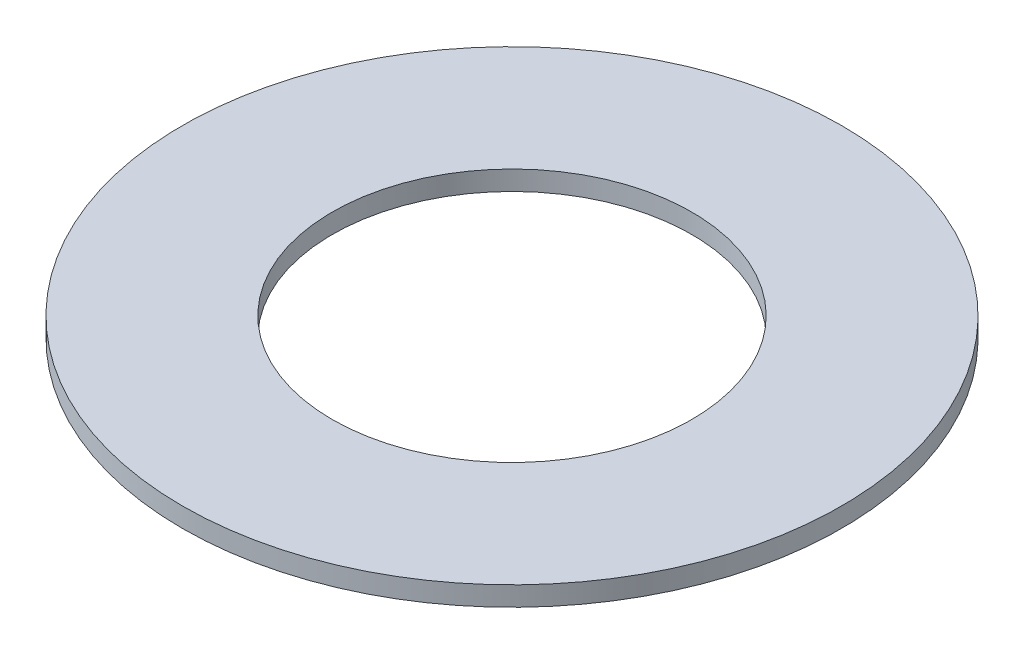
ISO-10303-21;
HEADER;
FILE_DESCRIPTION(('STEP AP214'),'2;1');
FILE_NAME('part.step','',(''),(''),'','','');
FILE_SCHEMA(('AUTOMOTIVE_DESIGN { 1 0 10303 214 1 1 1 1 }'));
ENDSEC;
DATA;
#1=APPLICATION_CONTEXT('core data for automotive mechanical design processes');
#2=APPLICATION_PROTOCOL_DEFINITION('international standard','automotive_design',2000,#1);
#3=PRODUCT_CONTEXT('',#1,'mechanical');
#4=PRODUCT('Part','Part','',(#3));
#5=PRODUCT_RELATED_PRODUCT_CATEGORY('part','',(#4));
#6=PRODUCT_DEFINITION_FORMATION('','',#4);
#7=PRODUCT_DEFINITION_CONTEXT('part definition',#1,'design');
#8=PRODUCT_DEFINITION('design','',#6,#7);
#9=PRODUCT_DEFINITION_SHAPE('','',#8);
#10=(LENGTH_UNIT() NAMED_UNIT(*) SI_UNIT(.MILLI.,.METRE.));
#11=(NAMED_UNIT(*) PLANE_ANGLE_UNIT() SI_UNIT($,.RADIAN.));
#12=(NAMED_UNIT(*) SI_UNIT($,.STERADIAN.) SOLID_ANGLE_UNIT());
#13=UNCERTAINTY_MEASURE_WITH_UNIT(LENGTH_MEASURE(1.E-05),#10,'distance_accuracy_value','');
#14=(GEOMETRIC_REPRESENTATION_CONTEXT(3) GLOBAL_UNCERTAINTY_ASSIGNED_CONTEXT((#13)) GLOBAL_UNIT_ASSIGNED_CONTEXT((#10,
#11,#12)) REPRESENTATION_CONTEXT('',''));
#15=CARTESIAN_POINT('',(0.,0.,0.));
#16=DIRECTION('',(0.,0.,1.));
#17=DIRECTION('',(1.,0.,0.));
#18=AXIS2_PLACEMENT_3D('',#15,#16,#17);
#19=CARTESIAN_POINT('',(0.,0.65,0.));
#20=DIRECTION('',(0.,1.,0.));
#21=DIRECTION('',(0.,0.,1.));
#22=AXIS2_PLACEMENT_3D('',#19,#20,#21);
#23=PLANE('',#22);
#24=CARTESIAN_POINT('',(0.,0.65,0.));
#25=DIRECTION('',(0.,1.,0.));
#26=DIRECTION('',(0.,0.,1.));
#27=AXIS2_PLACEMENT_3D('',#24,#25,#26);
#28=CIRCLE('',#27,11.);
#29=CARTESIAN_POINT('',(0.,0.65,11.));
#30=VERTEX_POINT('',#29);
#31=EDGE_CURVE('E10',#30,#30,#28,.T.);
#32=ORIENTED_EDGE('',*,*,#31,.T.);
#33=EDGE_LOOP('',(#32));
#34=FACE_BOUND('',#33,.T.);
#35=CARTESIAN_POINT('',(0.,0.65,0.));
#36=DIRECTION('',(0.,1.,0.));
#37=DIRECTION('',(0.,0.,1.));
#38=AXIS2_PLACEMENT_3D('',#35,#36,#37);
#39=CIRCLE('',#38,6.);
#40=CARTESIAN_POINT('',(0.,0.65,6.));
#41=VERTEX_POINT('',#40);
#42=EDGE_CURVE('E42',#41,#41,#39,.T.);
#43=ORIENTED_EDGE('',*,*,#42,.F.);
#44=EDGE_LOOP('',(#43));
#45=FACE_BOUND('',#44,.T.);
#46=ADVANCED_FACE('F31',(#34,#45),#23,.T.);
#47=CARTESIAN_POINT('',(0.,0.,0.));
#48=DIRECTION('',(0.,1.,0.));
#49=DIRECTION('',(0.,0.,1.));
#50=AXIS2_PLACEMENT_3D('',#47,#48,#49);
#51=PLANE('',#50);
#52=CARTESIAN_POINT('',(0.,0.,0.));
#53=DIRECTION('',(0.,1.,0.));
#54=DIRECTION('',(0.,0.,1.));
#55=AXIS2_PLACEMENT_3D('',#52,#53,#54);
#56=CIRCLE('',#55,11.);
#57=CARTESIAN_POINT('',(0.,0.,11.));
#58=VERTEX_POINT('',#57);
#59=EDGE_CURVE('E35',#58,#58,#56,.T.);
#60=ORIENTED_EDGE('',*,*,#59,.F.);
#61=EDGE_LOOP('',(#60));
#62=FACE_BOUND('',#61,.T.);
#63=CARTESIAN_POINT('',(0.,0.,0.));
#64=DIRECTION('',(0.,1.,0.));
#65=DIRECTION('',(0.,0.,1.));
#66=AXIS2_PLACEMENT_3D('',#63,#64,#65);
#67=CIRCLE('',#66,6.);
#68=CARTESIAN_POINT('',(0.,0.,6.));
#69=VERTEX_POINT('',#68);
#70=EDGE_CURVE('E44',#69,#69,#67,.T.);
#71=ORIENTED_EDGE('',*,*,#70,.T.);
#72=EDGE_LOOP('',(#71));
#73=FACE_BOUND('',#72,.T.);
#74=ADVANCED_FACE('F54',(#62,#73),#51,.F.);
#75=CARTESIAN_POINT('',(0.,0.65,0.));
#76=DIRECTION('',(0.,-1.,0.));
#77=DIRECTION('',(0.,0.,-1.));
#78=AXIS2_PLACEMENT_3D('',#75,#76,#77);
#79=CYLINDRICAL_SURFACE('',#78,11.);
#80=ORIENTED_EDGE('',*,*,#31,.F.);
#81=EDGE_LOOP('',(#80));
#82=FACE_BOUND('',#81,.T.);
#83=ORIENTED_EDGE('',*,*,#59,.T.);
#84=EDGE_LOOP('',(#83));
#85=FACE_BOUND('',#84,.T.);
#86=ADVANCED_FACE('F33',(#82,#85),#79,.T.);
#87=CARTESIAN_POINT('',(0.,0.65,0.));
#88=DIRECTION('',(0.,-1.,0.));
#89=DIRECTION('',(0.,0.,-1.));
#90=AXIS2_PLACEMENT_3D('',#87,#88,#89);
#91=CYLINDRICAL_SURFACE('',#90,6.);
#92=ORIENTED_EDGE('',*,*,#42,.T.);
#93=EDGE_LOOP('',(#92));
#94=FACE_BOUND('',#93,.T.);
#95=ORIENTED_EDGE('',*,*,#70,.F.);
#96=EDGE_LOOP('',(#95));
#97=FACE_BOUND('',#96,.T.);
#98=ADVANCED_FACE('F50',(#94,#97),#91,.F.);
#99=CLOSED_SHELL('',(#46,#74,#86,#98));
#100=MANIFOLD_SOLID_BREP('B2',#99);
#101=ADVANCED_BREP_SHAPE_REPRESENTATION('',(#18,#100),#14);
#102=SHAPE_DEFINITION_REPRESENTATION(#9,#101);
ENDSEC;
END-ISO-10303-21;
